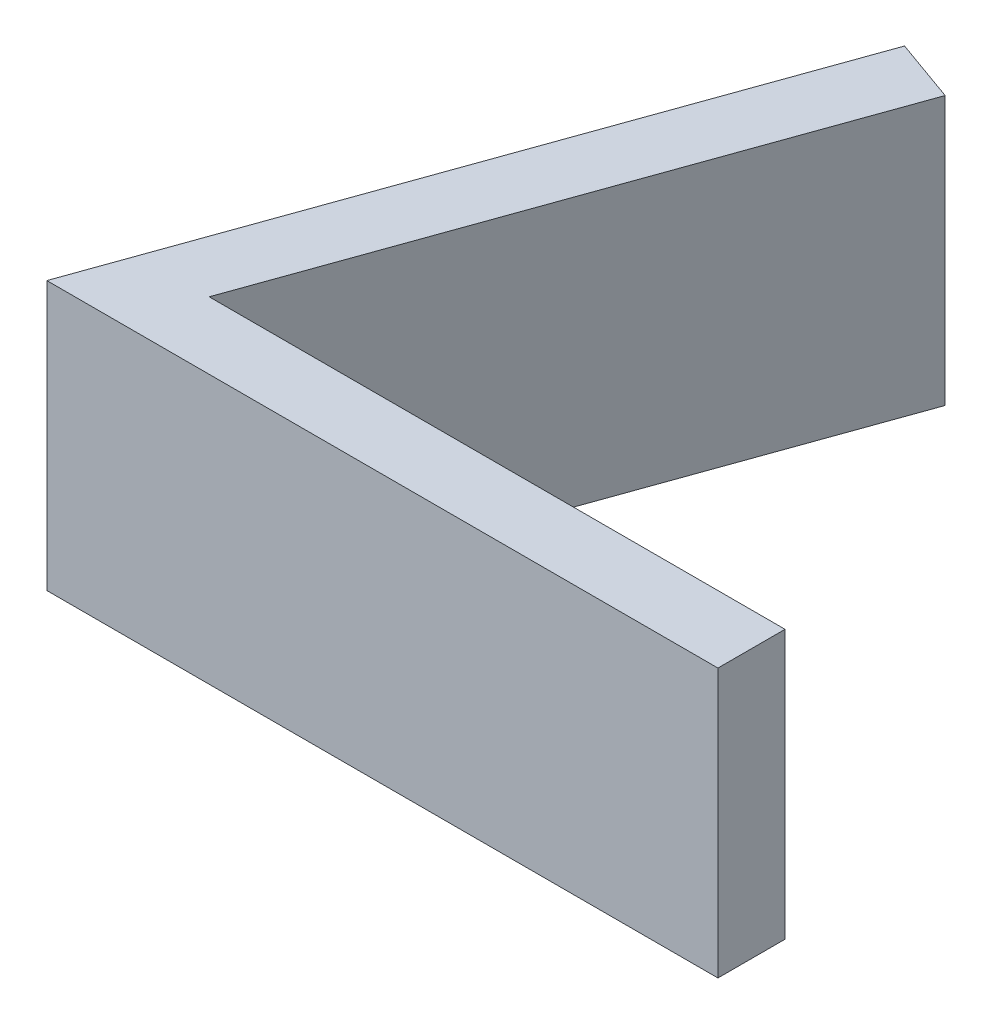
ISO-10303-21;
HEADER;
FILE_DESCRIPTION(('STEP AP214'),'2;1');
FILE_NAME('part.step','',(''),(''),'','','');
FILE_SCHEMA(('AUTOMOTIVE_DESIGN { 1 0 10303 214 1 1 1 1 }'));
ENDSEC;
DATA;
#1=APPLICATION_CONTEXT('core data for automotive mechanical design processes');
#2=APPLICATION_PROTOCOL_DEFINITION('international standard','automotive_design',2000,#1);
#3=PRODUCT_CONTEXT('',#1,'mechanical');
#4=PRODUCT('Part','Part','',(#3));
#5=PRODUCT_RELATED_PRODUCT_CATEGORY('part','',(#4));
#6=PRODUCT_DEFINITION_FORMATION('','',#4);
#7=PRODUCT_DEFINITION_CONTEXT('part definition',#1,'design');
#8=PRODUCT_DEFINITION('design','',#6,#7);
#9=PRODUCT_DEFINITION_SHAPE('','',#8);
#10=(LENGTH_UNIT() NAMED_UNIT(*) SI_UNIT(.MILLI.,.METRE.));
#11=(NAMED_UNIT(*) PLANE_ANGLE_UNIT() SI_UNIT($,.RADIAN.));
#12=(NAMED_UNIT(*) SI_UNIT($,.STERADIAN.) SOLID_ANGLE_UNIT());
#13=UNCERTAINTY_MEASURE_WITH_UNIT(LENGTH_MEASURE(1.E-05),#10,'distance_accuracy_value','');
#14=(GEOMETRIC_REPRESENTATION_CONTEXT(3) GLOBAL_UNCERTAINTY_ASSIGNED_CONTEXT((#13)) GLOBAL_UNIT_ASSIGNED_CONTEXT((#10,
#11,#12)) REPRESENTATION_CONTEXT('',''));
#15=CARTESIAN_POINT('',(0.,0.,0.));
#16=DIRECTION('',(0.,0.,1.));
#17=DIRECTION('',(1.,0.,0.));
#18=AXIS2_PLACEMENT_3D('',#15,#16,#17);
#19=CARTESIAN_POINT('',(0.,20.,0.));
#20=DIRECTION('',(0.,0.,-1.));
#21=DIRECTION('',(-1.,0.,0.));
#22=AXIS2_PLACEMENT_3D('',#19,#20,#21);
#23=PLANE('',#22);
#24=DIRECTION('',(1.,0.,0.));
#25=VECTOR('',#24,1.);
#26=CARTESIAN_POINT('',(0.,0.,0.));
#27=LINE('',#26,#25);
#28=CARTESIAN_POINT('',(-37.3203229951522,0.,0.));
#29=VERTEX_POINT('',#28);
#30=CARTESIAN_POINT('',(12.6796770048478,0.,0.));
#31=VERTEX_POINT('',#30);
#32=EDGE_CURVE('E82',#29,#31,#27,.T.);
#33=ORIENTED_EDGE('',*,*,#32,.T.);
#34=DIRECTION('',(0.,-1.,0.));
#35=VECTOR('',#34,1.);
#36=CARTESIAN_POINT('',(12.6796770048478,20.,0.));
#37=LINE('',#36,#35);
#38=CARTESIAN_POINT('',(12.6796770048478,20.,0.));
#39=VERTEX_POINT('',#38);
#40=EDGE_CURVE('E11',#39,#31,#37,.T.);
#41=ORIENTED_EDGE('',*,*,#40,.F.);
#42=DIRECTION('',(1.,0.,0.));
#43=VECTOR('',#42,1.);
#44=CARTESIAN_POINT('',(-37.3203229951522,20.,0.));
#45=LINE('',#44,#43);
#46=CARTESIAN_POINT('',(-37.3203229951522,20.,0.));
#47=VERTEX_POINT('',#46);
#48=EDGE_CURVE('E88',#47,#39,#45,.T.);
#49=ORIENTED_EDGE('',*,*,#48,.F.);
#50=DIRECTION('',(0.,-1.,0.));
#51=VECTOR('',#50,1.);
#52=CARTESIAN_POINT('',(-37.3203229951522,20.,0.));
#53=LINE('',#52,#51);
#54=EDGE_CURVE('E116',#47,#29,#53,.T.);
#55=ORIENTED_EDGE('',*,*,#54,.T.);
#56=EDGE_LOOP('',(#33,#41,#49,#55));
#57=FACE_BOUND('',#56,.T.);
#58=ADVANCED_FACE('F36',(#57),#23,.F.);
#59=CARTESIAN_POINT('',(12.6796770048478,20.,0.));
#60=DIRECTION('',(-1.,0.,0.));
#61=DIRECTION('',(0.,0.,1.));
#62=AXIS2_PLACEMENT_3D('',#59,#60,#61);
#63=PLANE('',#62);
#64=DIRECTION('',(0.,0.,-1.));
#65=VECTOR('',#64,1.);
#66=CARTESIAN_POINT('',(12.6796770048478,0.,0.));
#67=LINE('',#66,#65);
#68=CARTESIAN_POINT('',(12.6796770048478,0.,-5.));
#69=VERTEX_POINT('',#68);
#70=EDGE_CURVE('E121',#31,#69,#67,.T.);
#71=ORIENTED_EDGE('',*,*,#70,.T.);
#72=DIRECTION('',(0.,-1.,0.));
#73=VECTOR('',#72,1.);
#74=CARTESIAN_POINT('',(12.6796770048478,20.,-5.));
#75=LINE('',#74,#73);
#76=CARTESIAN_POINT('',(12.6796770048478,20.,-5.));
#77=VERTEX_POINT('',#76);
#78=EDGE_CURVE('E44',#77,#69,#75,.T.);
#79=ORIENTED_EDGE('',*,*,#78,.F.);
#80=DIRECTION('',(0.,0.,-1.));
#81=VECTOR('',#80,1.);
#82=CARTESIAN_POINT('',(12.6796770048478,20.,0.));
#83=LINE('',#82,#81);
#84=EDGE_CURVE('E143',#39,#77,#83,.T.);
#85=ORIENTED_EDGE('',*,*,#84,.F.);
#86=ORIENTED_EDGE('',*,*,#40,.T.);
#87=EDGE_LOOP('',(#71,#79,#85,#86));
#88=FACE_BOUND('',#87,.T.);
#89=ADVANCED_FACE('F146',(#88),#63,.F.);
#90=CARTESIAN_POINT('',(12.6796770048478,20.,-5.));
#91=DIRECTION('',(0.,0.,1.));
#92=DIRECTION('',(1.,0.,0.));
#93=AXIS2_PLACEMENT_3D('',#90,#91,#92);
#94=PLANE('',#93);
#95=DIRECTION('',(-1.,0.,0.));
#96=VECTOR('',#95,1.);
#97=CARTESIAN_POINT('',(12.6796770048478,0.,-5.));
#98=LINE('',#97,#96);
#99=CARTESIAN_POINT('',(-30.2252984370227,0.,-4.99999999999999));
#100=VERTEX_POINT('',#99);
#101=EDGE_CURVE('E123',#69,#100,#98,.T.);
#102=ORIENTED_EDGE('',*,*,#101,.T.);
#103=DIRECTION('',(0.,-1.,0.));
#104=VECTOR('',#103,1.);
#105=CARTESIAN_POINT('',(-30.2252984370227,20.,-4.99999999999999));
#106=LINE('',#105,#104);
#107=CARTESIAN_POINT('',(-30.2252984370227,20.,-4.99999999999999));
#108=VERTEX_POINT('',#107);
#109=EDGE_CURVE('E111',#108,#100,#106,.T.);
#110=ORIENTED_EDGE('',*,*,#109,.F.);
#111=DIRECTION('',(-1.,0.,0.));
#112=VECTOR('',#111,1.);
#113=CARTESIAN_POINT('',(12.6796770048478,20.,-5.));
#114=LINE('',#113,#112);
#115=EDGE_CURVE('E102',#77,#108,#114,.T.);
#116=ORIENTED_EDGE('',*,*,#115,.F.);
#117=ORIENTED_EDGE('',*,*,#78,.T.);
#118=EDGE_LOOP('',(#102,#110,#116,#117));
#119=FACE_BOUND('',#118,.T.);
#120=ADVANCED_FACE('F136',(#119),#94,.F.);
#121=CARTESIAN_POINT('',(-30.2252984370227,20.,-4.99999999999999));
#122=DIRECTION('',(-0.941741911348602,0.,-0.336336397687616));
#123=DIRECTION('',(-0.336336397687616,0.,0.941741911348602));
#124=AXIS2_PLACEMENT_3D('',#121,#122,#123);
#125=PLANE('',#124);
#126=DIRECTION('',(0.336336397687616,0.,-0.941741911348602));
#127=VECTOR('',#126,1.);
#128=CARTESIAN_POINT('',(-30.2252984370227,0.,-4.99999999999999));
#129=LINE('',#128,#127);
#130=CARTESIAN_POINT('',(-15.7947935540283,0.,-45.405413578992));
#131=VERTEX_POINT('',#130);
#132=EDGE_CURVE('E110',#100,#131,#129,.T.);
#133=ORIENTED_EDGE('',*,*,#132,.T.);
#134=DIRECTION('',(0.,-1.,0.));
#135=VECTOR('',#134,1.);
#136=CARTESIAN_POINT('',(-15.7947935540283,20.,-45.405413578992));
#137=LINE('',#136,#135);
#138=CARTESIAN_POINT('',(-15.7947935540283,20.,-45.405413578992));
#139=VERTEX_POINT('',#138);
#140=EDGE_CURVE('E107',#139,#131,#137,.T.);
#141=ORIENTED_EDGE('',*,*,#140,.F.);
#142=DIRECTION('',(0.336336397687616,0.,-0.941741911348602));
#143=VECTOR('',#142,1.);
#144=CARTESIAN_POINT('',(-30.2252984370227,20.,-4.99999999999999));
#145=LINE('',#144,#143);
#146=EDGE_CURVE('E96',#108,#139,#145,.T.);
#147=ORIENTED_EDGE('',*,*,#146,.F.);
#148=ORIENTED_EDGE('',*,*,#109,.T.);
#149=EDGE_LOOP('',(#133,#141,#147,#148));
#150=FACE_BOUND('',#149,.T.);
#151=ADVANCED_FACE('F108',(#150),#125,.F.);
#152=CARTESIAN_POINT('',(-15.7947935540283,20.,-45.405413578992));
#153=DIRECTION('',(-0.336336397687617,0.,0.941741911348601));
#154=DIRECTION('',(0.941741911348601,0.,0.336336397687617));
#155=AXIS2_PLACEMENT_3D('',#152,#153,#154);
#156=PLANE('',#155);
#157=DIRECTION('',(-0.941741911348601,0.,-0.336336397687617));
#158=VECTOR('',#157,1.);
#159=CARTESIAN_POINT('',(-15.7947935540283,0.,-45.405413578992));
#160=LINE('',#159,#158);
#161=CARTESIAN_POINT('',(-20.5035031107713,0.,-47.0870955674301));
#162=VERTEX_POINT('',#161);
#163=EDGE_CURVE('E75',#131,#162,#160,.T.);
#164=ORIENTED_EDGE('',*,*,#163,.T.);
#165=DIRECTION('',(0.,-1.,0.));
#166=VECTOR('',#165,1.);
#167=CARTESIAN_POINT('',(-20.5035031107713,20.,-47.0870955674301));
#168=LINE('',#167,#166);
#169=CARTESIAN_POINT('',(-20.5035031107713,20.,-47.0870955674301));
#170=VERTEX_POINT('',#169);
#171=EDGE_CURVE('E112',#170,#162,#168,.T.);
#172=ORIENTED_EDGE('',*,*,#171,.F.);
#173=DIRECTION('',(-0.941741911348601,0.,-0.336336397687617));
#174=VECTOR('',#173,1.);
#175=CARTESIAN_POINT('',(-15.7947935540283,20.,-45.405413578992));
#176=LINE('',#175,#174);
#177=EDGE_CURVE('E100',#139,#170,#176,.T.);
#178=ORIENTED_EDGE('',*,*,#177,.F.);
#179=ORIENTED_EDGE('',*,*,#140,.T.);
#180=EDGE_LOOP('',(#164,#172,#178,#179));
#181=FACE_BOUND('',#180,.T.);
#182=ADVANCED_FACE('F114',(#181),#156,.F.);
#183=CARTESIAN_POINT('',(-20.5035031107713,20.,-47.0870955674301));
#184=DIRECTION('',(0.941741911348602,0.,0.336336397687616));
#185=DIRECTION('',(0.336336397687616,0.,-0.941741911348602));
#186=AXIS2_PLACEMENT_3D('',#183,#184,#185);
#187=PLANE('',#186);
#188=DIRECTION('',(-0.336336397687616,0.,0.941741911348602));
#189=VECTOR('',#188,1.);
#190=CARTESIAN_POINT('',(-20.5035031107713,0.,-47.0870955674301));
#191=LINE('',#190,#189);
#192=EDGE_CURVE('E127',#162,#29,#191,.T.);
#193=ORIENTED_EDGE('',*,*,#192,.T.);
#194=ORIENTED_EDGE('',*,*,#54,.F.);
#195=DIRECTION('',(-0.336336397687616,0.,0.941741911348602));
#196=VECTOR('',#195,1.);
#197=CARTESIAN_POINT('',(-20.5035031107713,20.,-47.0870955674301));
#198=LINE('',#197,#196);
#199=EDGE_CURVE('E52',#170,#47,#198,.T.);
#200=ORIENTED_EDGE('',*,*,#199,.F.);
#201=ORIENTED_EDGE('',*,*,#171,.T.);
#202=EDGE_LOOP('',(#193,#194,#200,#201));
#203=FACE_BOUND('',#202,.T.);
#204=ADVANCED_FACE('F141',(#203),#187,.F.);
#205=CARTESIAN_POINT('',(0.,20.,0.));
#206=DIRECTION('',(0.,1.,0.));
#207=DIRECTION('',(0.,0.,1.));
#208=AXIS2_PLACEMENT_3D('',#205,#206,#207);
#209=PLANE('',#208);
#210=ORIENTED_EDGE('',*,*,#48,.T.);
#211=ORIENTED_EDGE('',*,*,#84,.T.);
#212=ORIENTED_EDGE('',*,*,#115,.T.);
#213=ORIENTED_EDGE('',*,*,#146,.T.);
#214=ORIENTED_EDGE('',*,*,#177,.T.);
#215=ORIENTED_EDGE('',*,*,#199,.T.);
#216=EDGE_LOOP('',(#210,#211,#212,#213,#214,#215));
#217=FACE_BOUND('',#216,.T.);
#218=ADVANCED_FACE('F98',(#217),#209,.T.);
#219=CARTESIAN_POINT('',(0.,0.,0.));
#220=DIRECTION('',(0.,1.,0.));
#221=DIRECTION('',(0.,0.,1.));
#222=AXIS2_PLACEMENT_3D('',#219,#220,#221);
#223=PLANE('',#222);
#224=ORIENTED_EDGE('',*,*,#32,.F.);
#225=ORIENTED_EDGE('',*,*,#192,.F.);
#226=ORIENTED_EDGE('',*,*,#163,.F.);
#227=ORIENTED_EDGE('',*,*,#132,.F.);
#228=ORIENTED_EDGE('',*,*,#101,.F.);
#229=ORIENTED_EDGE('',*,*,#70,.F.);
#230=EDGE_LOOP('',(#224,#225,#226,#227,#228,#229));
#231=FACE_BOUND('',#230,.T.);
#232=ADVANCED_FACE('F139',(#231),#223,.F.);
#233=CLOSED_SHELL('',(#58,#89,#120,#151,#182,#204,#218,#232));
#234=MANIFOLD_SOLID_BREP('B2',#233);
#235=ADVANCED_BREP_SHAPE_REPRESENTATION('',(#18,#234),#14);
#236=SHAPE_DEFINITION_REPRESENTATION(#9,#235);
ENDSEC;
END-ISO-10303-21;
